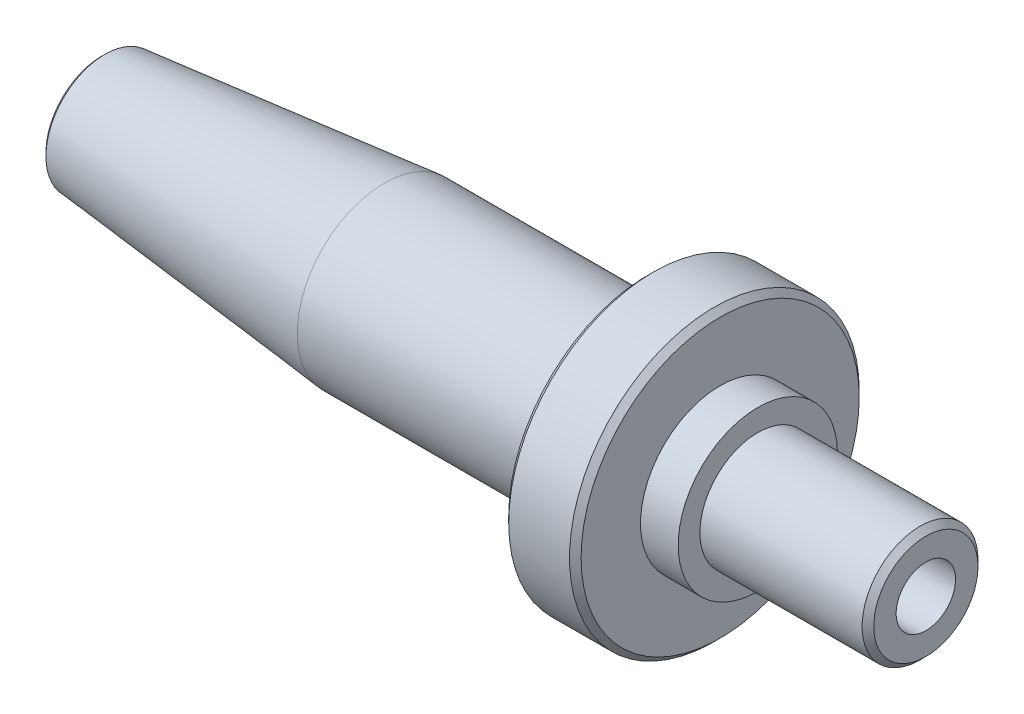
ISO-10303-21;
HEADER;
FILE_DESCRIPTION(('STEP AP214'),'2;1');
FILE_NAME('part.step','',(''),(''),'','','');
FILE_SCHEMA(('AUTOMOTIVE_DESIGN { 1 0 10303 214 1 1 1 1 }'));
ENDSEC;
DATA;
#1=APPLICATION_CONTEXT('core data for automotive mechanical design processes');
#2=APPLICATION_PROTOCOL_DEFINITION('international standard','automotive_design',2000,#1);
#3=PRODUCT_CONTEXT('',#1,'mechanical');
#4=PRODUCT('Part','Part','',(#3));
#5=PRODUCT_RELATED_PRODUCT_CATEGORY('part','',(#4));
#6=PRODUCT_DEFINITION_FORMATION('','',#4);
#7=PRODUCT_DEFINITION_CONTEXT('part definition',#1,'design');
#8=PRODUCT_DEFINITION('design','',#6,#7);
#9=PRODUCT_DEFINITION_SHAPE('','',#8);
#10=(LENGTH_UNIT() NAMED_UNIT(*) SI_UNIT(.MILLI.,.METRE.));
#11=(NAMED_UNIT(*) PLANE_ANGLE_UNIT() SI_UNIT($,.RADIAN.));
#12=(NAMED_UNIT(*) SI_UNIT($,.STERADIAN.) SOLID_ANGLE_UNIT());
#13=UNCERTAINTY_MEASURE_WITH_UNIT(LENGTH_MEASURE(1.E-05),#10,'distance_accuracy_value','');
#14=(GEOMETRIC_REPRESENTATION_CONTEXT(3) GLOBAL_UNCERTAINTY_ASSIGNED_CONTEXT((#13)) GLOBAL_UNIT_ASSIGNED_CONTEXT((#10,
#11,#12)) REPRESENTATION_CONTEXT('',''));
#15=CARTESIAN_POINT('',(0.,0.,0.));
#16=DIRECTION('',(0.,0.,1.));
#17=DIRECTION('',(1.,0.,0.));
#18=AXIS2_PLACEMENT_3D('',#15,#16,#17);
#19=CARTESIAN_POINT('',(-14.225,0.,0.));
#20=DIRECTION('',(-1.,0.,0.));
#21=DIRECTION('',(0.,0.,1.));
#22=AXIS2_PLACEMENT_3D('',#19,#20,#21);
#23=PLANE('',#22);
#24=CARTESIAN_POINT('',(-14.225,0.,0.));
#25=DIRECTION('',(-1.,0.,0.));
#26=DIRECTION('',(0.,0.,1.));
#27=AXIS2_PLACEMENT_3D('',#24,#25,#26);
#28=CIRCLE('',#27,1.25);
#29=CARTESIAN_POINT('',(-14.225,0.,1.25));
#30=VERTEX_POINT('',#29);
#31=EDGE_CURVE('E63',#30,#30,#28,.T.);
#32=ORIENTED_EDGE('',*,*,#31,.F.);
#33=EDGE_LOOP('',(#32));
#34=FACE_BOUND('',#33,.T.);
#35=CARTESIAN_POINT('',(-14.225,0.,0.));
#36=DIRECTION('',(-1.,0.,0.));
#37=DIRECTION('',(0.,0.,1.));
#38=AXIS2_PLACEMENT_3D('',#35,#36,#37);
#39=CIRCLE('',#38,1.92500000000001);
#40=CARTESIAN_POINT('',(-14.225,0.,-1.92500000000001));
#41=VERTEX_POINT('',#40);
#42=EDGE_CURVE('E95',#41,#41,#39,.T.);
#43=ORIENTED_EDGE('',*,*,#42,.T.);
#44=EDGE_LOOP('',(#43));
#45=FACE_BOUND('',#44,.T.);
#46=ADVANCED_FACE('F39',(#34,#45),#23,.T.);
#47=CARTESIAN_POINT('',(-4.475,0.,0.));
#48=DIRECTION('',(1.,0.,0.));
#49=DIRECTION('',(0.,0.,-1.));
#50=AXIS2_PLACEMENT_3D('',#47,#48,#49);
#51=CONICAL_SURFACE('',#50,3.00000000000001,0.0996686524911621);
#52=CARTESIAN_POINT('',(-14.1138888888889,0.,0.));
#53=DIRECTION('',(-1.,0.,0.));
#54=DIRECTION('',(0.,0.,1.));
#55=AXIS2_PLACEMENT_3D('',#52,#53,#54);
#56=CIRCLE('',#55,2.03611111111112);
#57=CARTESIAN_POINT('',(-14.1138888888889,0.,-2.03611111111112));
#58=VERTEX_POINT('',#57);
#59=EDGE_CURVE('E92',#58,#58,#56,.F.);
#60=ORIENTED_EDGE('',*,*,#59,.T.);
#61=EDGE_LOOP('',(#60));
#62=FACE_BOUND('',#61,.T.);
#63=CARTESIAN_POINT('',(-4.475,0.,0.));
#64=DIRECTION('',(1.,0.,0.));
#65=DIRECTION('',(0.,0.,-1.));
#66=AXIS2_PLACEMENT_3D('',#63,#64,#65);
#67=CIRCLE('',#66,3.00000000000001);
#68=CARTESIAN_POINT('',(-4.475,0.,-3.00000000000001));
#69=VERTEX_POINT('',#68);
#70=EDGE_CURVE('E89',#69,#69,#67,.T.);
#71=ORIENTED_EDGE('',*,*,#70,.F.);
#72=EDGE_LOOP('',(#71));
#73=FACE_BOUND('',#72,.T.);
#74=ADVANCED_FACE('F157',(#62,#73),#51,.T.);
#75=CARTESIAN_POINT('',(14.225,0.,0.));
#76=DIRECTION('',(1.,0.,0.));
#77=DIRECTION('',(0.,0.,-1.));
#78=AXIS2_PLACEMENT_3D('',#75,#76,#77);
#79=CYLINDRICAL_SURFACE('',#78,3.00000000000001);
#80=ORIENTED_EDGE('',*,*,#70,.T.);
#81=EDGE_LOOP('',(#80));
#82=FACE_BOUND('',#81,.T.);
#83=CARTESIAN_POINT('',(3.625,0.,0.));
#84=DIRECTION('',(1.,0.,0.));
#85=DIRECTION('',(0.,0.,-1.));
#86=AXIS2_PLACEMENT_3D('',#83,#84,#85);
#87=CIRCLE('',#86,3.00000000000001);
#88=CARTESIAN_POINT('',(3.625,0.,-3.00000000000001));
#89=VERTEX_POINT('',#88);
#90=EDGE_CURVE('E86',#89,#89,#87,.T.);
#91=ORIENTED_EDGE('',*,*,#90,.F.);
#92=EDGE_LOOP('',(#91));
#93=FACE_BOUND('',#92,.T.);
#94=ADVANCED_FACE('F163',(#82,#93),#79,.T.);
#95=CARTESIAN_POINT('',(3.625,3.,0.));
#96=DIRECTION('',(-1.,0.,0.));
#97=DIRECTION('',(0.,0.,1.));
#98=AXIS2_PLACEMENT_3D('',#95,#96,#97);
#99=PLANE('',#98);
#100=CARTESIAN_POINT('',(3.625,0.,0.));
#101=DIRECTION('',(-1.,0.,0.));
#102=DIRECTION('',(0.,0.,1.));
#103=AXIS2_PLACEMENT_3D('',#100,#101,#102);
#104=CIRCLE('',#103,3.3);
#105=CARTESIAN_POINT('',(3.625,0.,3.3));
#106=VERTEX_POINT('',#105);
#107=EDGE_CURVE('E101',#106,#106,#104,.T.);
#108=ORIENTED_EDGE('',*,*,#107,.T.);
#109=EDGE_LOOP('',(#108));
#110=FACE_BOUND('',#109,.T.);
#111=ORIENTED_EDGE('',*,*,#90,.T.);
#112=EDGE_LOOP('',(#111));
#113=FACE_BOUND('',#112,.T.);
#114=ADVANCED_FACE('F250',(#110,#113),#99,.T.);
#115=CARTESIAN_POINT('',(14.225,0.,0.));
#116=DIRECTION('',(1.,0.,0.));
#117=DIRECTION('',(0.,0.,-1.));
#118=AXIS2_PLACEMENT_3D('',#115,#116,#117);
#119=CYLINDRICAL_SURFACE('',#118,3.5);
#120=CARTESIAN_POINT('',(3.825,0.,0.));
#121=DIRECTION('',(-1.,0.,0.));
#122=DIRECTION('',(0.,0.,1.));
#123=AXIS2_PLACEMENT_3D('',#120,#121,#122);
#124=CIRCLE('',#123,3.5);
#125=CARTESIAN_POINT('',(3.825,0.,3.5));
#126=VERTEX_POINT('',#125);
#127=EDGE_CURVE('E98',#126,#126,#124,.F.);
#128=ORIENTED_EDGE('',*,*,#127,.T.);
#129=EDGE_LOOP('',(#128));
#130=FACE_BOUND('',#129,.T.);
#131=CARTESIAN_POINT('',(4.625,0.,0.));
#132=DIRECTION('',(1.,0.,0.));
#133=DIRECTION('',(0.,0.,-1.));
#134=AXIS2_PLACEMENT_3D('',#131,#132,#133);
#135=CIRCLE('',#134,3.5);
#136=CARTESIAN_POINT('',(4.625,0.,-3.5));
#137=VERTEX_POINT('',#136);
#138=EDGE_CURVE('E83',#137,#137,#135,.T.);
#139=ORIENTED_EDGE('',*,*,#138,.F.);
#140=EDGE_LOOP('',(#139));
#141=FACE_BOUND('',#140,.T.);
#142=ADVANCED_FACE('F255',(#130,#141),#119,.T.);
#143=CARTESIAN_POINT('',(4.625,3.5,0.));
#144=DIRECTION('',(-1.,0.,0.));
#145=DIRECTION('',(0.,0.,1.));
#146=AXIS2_PLACEMENT_3D('',#143,#144,#145);
#147=PLANE('',#146);
#148=CARTESIAN_POINT('',(4.625,0.,0.));
#149=DIRECTION('',(-1.,0.,0.));
#150=DIRECTION('',(0.,0.,1.));
#151=AXIS2_PLACEMENT_3D('',#148,#149,#150);
#152=CIRCLE('',#151,4.8);
#153=CARTESIAN_POINT('',(4.625,0.,4.8));
#154=VERTEX_POINT('',#153);
#155=EDGE_CURVE('E11',#154,#154,#152,.T.);
#156=ORIENTED_EDGE('',*,*,#155,.T.);
#157=EDGE_LOOP('',(#156));
#158=FACE_BOUND('',#157,.T.);
#159=ORIENTED_EDGE('',*,*,#138,.T.);
#160=EDGE_LOOP('',(#159));
#161=FACE_BOUND('',#160,.T.);
#162=ADVANCED_FACE('F266',(#158,#161),#147,.T.);
#163=CARTESIAN_POINT('',(14.225,0.,0.));
#164=DIRECTION('',(1.,0.,0.));
#165=DIRECTION('',(0.,0.,-1.));
#166=AXIS2_PLACEMENT_3D('',#163,#164,#165);
#167=CYLINDRICAL_SURFACE('',#166,5.);
#168=CARTESIAN_POINT('',(6.92499999999999,0.,0.));
#169=DIRECTION('',(1.,0.,0.));
#170=DIRECTION('',(0.,0.,-1.));
#171=AXIS2_PLACEMENT_3D('',#168,#169,#170);
#172=CIRCLE('',#171,5.);
#173=CARTESIAN_POINT('',(6.92499999999999,0.,-5.));
#174=VERTEX_POINT('',#173);
#175=EDGE_CURVE('E47',#174,#174,#172,.F.);
#176=ORIENTED_EDGE('',*,*,#175,.T.);
#177=EDGE_LOOP('',(#176));
#178=FACE_BOUND('',#177,.T.);
#179=CARTESIAN_POINT('',(4.825,0.,0.));
#180=DIRECTION('',(-1.,0.,0.));
#181=DIRECTION('',(0.,0.,1.));
#182=AXIS2_PLACEMENT_3D('',#179,#180,#181);
#183=CIRCLE('',#182,5.);
#184=CARTESIAN_POINT('',(4.825,0.,5.));
#185=VERTEX_POINT('',#184);
#186=EDGE_CURVE('E113',#185,#185,#183,.F.);
#187=ORIENTED_EDGE('',*,*,#186,.T.);
#188=EDGE_LOOP('',(#187));
#189=FACE_BOUND('',#188,.T.);
#190=ADVANCED_FACE('F118',(#178,#189),#167,.T.);
#191=CARTESIAN_POINT('',(7.125,5.,0.));
#192=DIRECTION('',(1.,0.,0.));
#193=DIRECTION('',(0.,0.,-1.));
#194=AXIS2_PLACEMENT_3D('',#191,#192,#193);
#195=PLANE('',#194);
#196=CARTESIAN_POINT('',(7.125,0.,0.));
#197=DIRECTION('',(1.,0.,0.));
#198=DIRECTION('',(0.,0.,-1.));
#199=AXIS2_PLACEMENT_3D('',#196,#197,#198);
#200=CIRCLE('',#199,4.8);
#201=CARTESIAN_POINT('',(7.125,0.,-4.8));
#202=VERTEX_POINT('',#201);
#203=EDGE_CURVE('E110',#202,#202,#200,.T.);
#204=ORIENTED_EDGE('',*,*,#203,.T.);
#205=EDGE_LOOP('',(#204));
#206=FACE_BOUND('',#205,.T.);
#207=CARTESIAN_POINT('',(7.125,0.,0.));
#208=DIRECTION('',(1.,0.,0.));
#209=DIRECTION('',(0.,0.,-1.));
#210=AXIS2_PLACEMENT_3D('',#207,#208,#209);
#211=CIRCLE('',#210,2.75);
#212=CARTESIAN_POINT('',(7.125,0.,-2.75));
#213=VERTEX_POINT('',#212);
#214=EDGE_CURVE('E80',#213,#213,#211,.T.);
#215=ORIENTED_EDGE('',*,*,#214,.F.);
#216=EDGE_LOOP('',(#215));
#217=FACE_BOUND('',#216,.T.);
#218=ADVANCED_FACE('F127',(#206,#217),#195,.T.);
#219=CARTESIAN_POINT('',(14.225,0.,0.));
#220=DIRECTION('',(1.,0.,0.));
#221=DIRECTION('',(0.,0.,-1.));
#222=AXIS2_PLACEMENT_3D('',#219,#220,#221);
#223=CYLINDRICAL_SURFACE('',#222,2.75);
#224=ORIENTED_EDGE('',*,*,#214,.T.);
#225=EDGE_LOOP('',(#224));
#226=FACE_BOUND('',#225,.T.);
#227=CARTESIAN_POINT('',(8.425,0.,0.));
#228=DIRECTION('',(1.,0.,0.));
#229=DIRECTION('',(0.,0.,-1.));
#230=AXIS2_PLACEMENT_3D('',#227,#228,#229);
#231=CIRCLE('',#230,2.75);
#232=CARTESIAN_POINT('',(8.425,0.,-2.75));
#233=VERTEX_POINT('',#232);
#234=EDGE_CURVE('E77',#233,#233,#231,.T.);
#235=ORIENTED_EDGE('',*,*,#234,.F.);
#236=EDGE_LOOP('',(#235));
#237=FACE_BOUND('',#236,.T.);
#238=ADVANCED_FACE('F130',(#226,#237),#223,.T.);
#239=CARTESIAN_POINT('',(8.425,2.75,0.));
#240=DIRECTION('',(1.,0.,0.));
#241=DIRECTION('',(0.,0.,-1.));
#242=AXIS2_PLACEMENT_3D('',#239,#240,#241);
#243=PLANE('',#242);
#244=ORIENTED_EDGE('',*,*,#234,.T.);
#245=EDGE_LOOP('',(#244));
#246=FACE_BOUND('',#245,.T.);
#247=CARTESIAN_POINT('',(8.425,0.,0.));
#248=DIRECTION('',(1.,0.,0.));
#249=DIRECTION('',(0.,0.,-1.));
#250=AXIS2_PLACEMENT_3D('',#247,#248,#249);
#251=CIRCLE('',#250,2.);
#252=CARTESIAN_POINT('',(8.425,0.,-2.));
#253=VERTEX_POINT('',#252);
#254=EDGE_CURVE('E74',#253,#253,#251,.T.);
#255=ORIENTED_EDGE('',*,*,#254,.F.);
#256=EDGE_LOOP('',(#255));
#257=FACE_BOUND('',#256,.T.);
#258=ADVANCED_FACE('F136',(#246,#257),#243,.T.);
#259=CARTESIAN_POINT('',(14.225,0.,0.));
#260=DIRECTION('',(1.,0.,0.));
#261=DIRECTION('',(0.,0.,-1.));
#262=AXIS2_PLACEMENT_3D('',#259,#260,#261);
#263=CYLINDRICAL_SURFACE('',#262,2.);
#264=CARTESIAN_POINT('',(14.025,0.,0.));
#265=DIRECTION('',(1.,0.,0.));
#266=DIRECTION('',(0.,0.,-1.));
#267=AXIS2_PLACEMENT_3D('',#264,#265,#266);
#268=CIRCLE('',#267,2.);
#269=CARTESIAN_POINT('',(14.025,0.,-2.));
#270=VERTEX_POINT('',#269);
#271=EDGE_CURVE('E107',#270,#270,#268,.F.);
#272=ORIENTED_EDGE('',*,*,#271,.T.);
#273=EDGE_LOOP('',(#272));
#274=FACE_BOUND('',#273,.T.);
#275=ORIENTED_EDGE('',*,*,#254,.T.);
#276=EDGE_LOOP('',(#275));
#277=FACE_BOUND('',#276,.T.);
#278=ADVANCED_FACE('F142',(#274,#277),#263,.T.);
#279=CARTESIAN_POINT('',(14.225,2.,0.));
#280=DIRECTION('',(1.,0.,0.));
#281=DIRECTION('',(0.,0.,-1.));
#282=AXIS2_PLACEMENT_3D('',#279,#280,#281);
#283=PLANE('',#282);
#284=CARTESIAN_POINT('',(14.225,0.,0.));
#285=DIRECTION('',(1.,0.,0.));
#286=DIRECTION('',(0.,0.,-1.));
#287=AXIS2_PLACEMENT_3D('',#284,#285,#286);
#288=CIRCLE('',#287,1.025);
#289=CARTESIAN_POINT('',(14.225,0.,-1.025));
#290=VERTEX_POINT('',#289);
#291=EDGE_CURVE('E64',#290,#290,#288,.T.);
#292=ORIENTED_EDGE('',*,*,#291,.F.);
#293=EDGE_LOOP('',(#292));
#294=FACE_BOUND('',#293,.T.);
#295=CARTESIAN_POINT('',(14.225,0.,0.));
#296=DIRECTION('',(1.,0.,0.));
#297=DIRECTION('',(0.,0.,-1.));
#298=AXIS2_PLACEMENT_3D('',#295,#296,#297);
#299=CIRCLE('',#298,1.8);
#300=CARTESIAN_POINT('',(14.225,0.,-1.8));
#301=VERTEX_POINT('',#300);
#302=EDGE_CURVE('E104',#301,#301,#299,.T.);
#303=ORIENTED_EDGE('',*,*,#302,.T.);
#304=EDGE_LOOP('',(#303));
#305=FACE_BOUND('',#304,.T.);
#306=ADVANCED_FACE('F147',(#294,#305),#283,.T.);
#307=CARTESIAN_POINT('',(-14.1138888888889,0.,0.));
#308=DIRECTION('',(1.,0.,0.));
#309=DIRECTION('',(0.,0.,-1.));
#310=AXIS2_PLACEMENT_3D('',#307,#308,#309);
#311=CONICAL_SURFACE('',#310,2.03611111111112,0.78539816339745);
#312=CARTESIAN_POINT('',(-14.225,0.,-1.92500000000001));
#313=CARTESIAN_POINT('',(-14.2238425925926,0.,-1.92615740740742));
#314=CARTESIAN_POINT('',(-14.2226851851852,0.,-1.92731481481482));
#315=CARTESIAN_POINT('',(-14.2203703703704,0.,-1.92962962962964));
#316=CARTESIAN_POINT('',(-14.219212962963,0.,-1.93078703703705));
#317=CARTESIAN_POINT('',(-14.2168981481481,0.,-1.93310185185186));
#318=CARTESIAN_POINT('',(-14.2157407407407,0.,-1.93425925925927));
#319=CARTESIAN_POINT('',(-14.2134259259259,0.,-1.93657407407408));
#320=CARTESIAN_POINT('',(-14.2122685185185,0.,-1.93773148148149));
#321=CARTESIAN_POINT('',(-14.2099537037037,0.,-1.9400462962963));
#322=CARTESIAN_POINT('',(-14.2087962962963,0.,-1.94120370370371));
#323=CARTESIAN_POINT('',(-14.2064814814815,0.,-1.94351851851853));
#324=CARTESIAN_POINT('',(-14.2053240740741,0.,-1.94467592592593));
#325=CARTESIAN_POINT('',(-14.2030092592593,0.,-1.94699074074075));
#326=CARTESIAN_POINT('',(-14.2018518518519,0.,-1.94814814814816));
#327=CARTESIAN_POINT('',(-14.199537037037,0.,-1.95046296296297));
#328=CARTESIAN_POINT('',(-14.1983796296296,0.,-1.95162037037038));
#329=CARTESIAN_POINT('',(-14.1960648148148,0.,-1.95393518518519));
#330=CARTESIAN_POINT('',(-14.1949074074074,0.,-1.9550925925926));
#331=CARTESIAN_POINT('',(-14.1925925925926,0.,-1.95740740740742));
#332=CARTESIAN_POINT('',(-14.1914351851852,0.,-1.95856481481482));
#333=CARTESIAN_POINT('',(-14.1891203703704,0.,-1.96087962962964));
#334=CARTESIAN_POINT('',(-14.187962962963,0.,-1.96203703703704));
#335=CARTESIAN_POINT('',(-14.1856481481481,0.,-1.96435185185186));
#336=CARTESIAN_POINT('',(-14.1844907407407,0.,-1.96550925925927));
#337=CARTESIAN_POINT('',(-14.1821759259259,0.,-1.96782407407408));
#338=CARTESIAN_POINT('',(-14.1810185185185,0.,-1.96898148148149));
#339=CARTESIAN_POINT('',(-14.1787037037037,0.,-1.9712962962963));
#340=CARTESIAN_POINT('',(-14.1775462962963,0.,-1.97245370370371));
#341=CARTESIAN_POINT('',(-14.1752314814815,0.,-1.97476851851853));
#342=CARTESIAN_POINT('',(-14.1740740740741,0.,-1.97592592592593));
#343=CARTESIAN_POINT('',(-14.1717592592593,0.,-1.97824074074075));
#344=CARTESIAN_POINT('',(-14.1706018518519,0.,-1.97939814814815));
#345=CARTESIAN_POINT('',(-14.168287037037,0.,-1.98171296296297));
#346=CARTESIAN_POINT('',(-14.1671296296296,0.,-1.98287037037038));
#347=CARTESIAN_POINT('',(-14.1648148148148,0.,-1.98518518518519));
#348=CARTESIAN_POINT('',(-14.1636574074074,0.,-1.9863425925926));
#349=CARTESIAN_POINT('',(-14.1613425925926,0.,-1.98865740740741));
#350=CARTESIAN_POINT('',(-14.1601851851852,0.,-1.98981481481482));
#351=CARTESIAN_POINT('',(-14.1578703703704,0.,-1.99212962962964));
#352=CARTESIAN_POINT('',(-14.156712962963,0.,-1.99328703703704));
#353=CARTESIAN_POINT('',(-14.1543981481482,0.,-1.99560185185186));
#354=CARTESIAN_POINT('',(-14.1532407407407,0.,-1.99675925925927));
#355=CARTESIAN_POINT('',(-14.1509259259259,0.,-1.99907407407408));
#356=CARTESIAN_POINT('',(-14.1497685185185,0.,-2.00023148148149));
#357=CARTESIAN_POINT('',(-14.1474537037037,0.,-2.0025462962963));
#358=CARTESIAN_POINT('',(-14.1462962962963,0.,-2.00370370370371));
#359=CARTESIAN_POINT('',(-14.1439814814815,0.,-2.00601851851852));
#360=CARTESIAN_POINT('',(-14.1428240740741,0.,-2.00717592592593));
#361=CARTESIAN_POINT('',(-14.1405092592593,0.,-2.00949074074075));
#362=CARTESIAN_POINT('',(-14.1393518518519,0.,-2.01064814814815));
#363=CARTESIAN_POINT('',(-14.137037037037,0.,-2.01296296296297));
#364=CARTESIAN_POINT('',(-14.1358796296296,0.,-2.01412037037038));
#365=CARTESIAN_POINT('',(-14.1335648148148,0.,-2.01643518518519));
#366=CARTESIAN_POINT('',(-14.1324074074074,0.,-2.0175925925926));
#367=CARTESIAN_POINT('',(-14.1300925925926,0.,-2.01990740740741));
#368=CARTESIAN_POINT('',(-14.1289351851852,0.,-2.02106481481482));
#369=CARTESIAN_POINT('',(-14.1266203703704,0.,-2.02337962962963));
#370=CARTESIAN_POINT('',(-14.125462962963,0.,-2.02453703703704));
#371=CARTESIAN_POINT('',(-14.1231481481482,0.,-2.02685185185186));
#372=CARTESIAN_POINT('',(-14.1219907407407,0.,-2.02800925925926));
#373=CARTESIAN_POINT('',(-14.1196759259259,0.,-2.03032407407408));
#374=CARTESIAN_POINT('',(-14.1185185185185,0.,-2.03148148148149));
#375=CARTESIAN_POINT('',(-14.1162037037037,0.,-2.0337962962963));
#376=CARTESIAN_POINT('',(-14.1150462962963,0.,-2.03495370370371));
#377=CARTESIAN_POINT('',(-14.1138888888889,0.,-2.03611111111112));
#378=B_SPLINE_CURVE_WITH_KNOTS('',3,(#312,#313,#314,#315,#316,#317,#318,#319,#320,#321,#322,
#323,#324,#325,#326,#327,#328,#329,#330,#331,#332,#333,#334,#335,#336,#337,#338,#339,#340,#341,
#342,#343,#344,#345,#346,#347,#348,#349,#350,#351,#352,#353,#354,#355,#356,#357,#358,#359,#360,
#361,#362,#363,#364,#365,#366,#367,#368,#369,#370,#371,#372,#373,#374,#375,#376,#377),
.UNSPECIFIED.,.F.,.F.,(4,2,2,2,2,2,2,2,2,2,2,2,2,2,2,2,2,2,2,2,2,2,2,2,2,2,2,2,2,2,2,2,4),(0.,
0.00491046375823988,0.00982092751647977,0.0147313912747198,0.0196418550329597,
0.0245523187911983,0.0294627825494384,0.0343732463076783,0.0392837100659182,0.044194173824158,
0.0491046375823967,0.0540151013406369,0.0589255650988768,0.0638360288571166,0.0687464926153553,
0.0736569563735952,0.0785674201318351,0.0834778838900753,0.0883883476483151,0.0932988114065538,
0.0982092751647937,0.103119738923034,0.108030202681273,0.112940666439512,0.117851130197752,
0.122761593955992,0.127672057714232,0.132582521472472,0.137492985230711,0.142403448988951,
0.147313912747191,0.152224376505431,0.15713484026367),.UNSPECIFIED.);
#379=EDGE_CURVE('BSEAM153',#41,#58,#378,.T.);
#380=ORIENTED_EDGE('',*,*,#42,.F.);
#381=ORIENTED_EDGE('',*,*,#59,.F.);
#382=ORIENTED_EDGE('',*,*,#379,.T.);
#383=ORIENTED_EDGE('',*,*,#379,.F.);
#384=EDGE_LOOP('',(#380,#382,#381,#383));
#385=FACE_BOUND('',#384,.T.);
#386=ADVANCED_FACE('F153',(#385),#311,.T.);
#387=CARTESIAN_POINT('',(3.825,0.,0.));
#388=DIRECTION('',(1.,0.,0.));
#389=DIRECTION('',(0.,0.,-1.));
#390=AXIS2_PLACEMENT_3D('',#387,#388,#389);
#391=CONICAL_SURFACE('',#390,3.5,0.785398163397459);
#392=ORIENTED_EDGE('',*,*,#107,.F.);
#393=EDGE_LOOP('',(#392));
#394=FACE_BOUND('',#393,.T.);
#395=ORIENTED_EDGE('',*,*,#127,.F.);
#396=EDGE_LOOP('',(#395));
#397=FACE_BOUND('',#396,.T.);
#398=ADVANCED_FACE('F172',(#394,#397),#391,.T.);
#399=CARTESIAN_POINT('',(14.225,0.,0.));
#400=DIRECTION('',(-1.,0.,0.));
#401=DIRECTION('',(0.,0.,1.));
#402=AXIS2_PLACEMENT_3D('',#399,#400,#401);
#403=CONICAL_SURFACE('',#402,1.8,0.785398163397438);
#404=ORIENTED_EDGE('',*,*,#271,.F.);
#405=EDGE_LOOP('',(#404));
#406=FACE_BOUND('',#405,.T.);
#407=ORIENTED_EDGE('',*,*,#302,.F.);
#408=EDGE_LOOP('',(#407));
#409=FACE_BOUND('',#408,.T.);
#410=ADVANCED_FACE('F124',(#406,#409),#403,.T.);
#411=CARTESIAN_POINT('',(7.125,0.,0.));
#412=DIRECTION('',(-1.,0.,0.));
#413=DIRECTION('',(0.,0.,1.));
#414=AXIS2_PLACEMENT_3D('',#411,#412,#413);
#415=CONICAL_SURFACE('',#414,4.8,0.785398163397444);
#416=ORIENTED_EDGE('',*,*,#175,.F.);
#417=EDGE_LOOP('',(#416));
#418=FACE_BOUND('',#417,.T.);
#419=ORIENTED_EDGE('',*,*,#203,.F.);
#420=EDGE_LOOP('',(#419));
#421=FACE_BOUND('',#420,.T.);
#422=ADVANCED_FACE('F121',(#418,#421),#415,.T.);
#423=CARTESIAN_POINT('',(4.825,0.,0.));
#424=DIRECTION('',(1.,0.,0.));
#425=DIRECTION('',(0.,0.,-1.));
#426=AXIS2_PLACEMENT_3D('',#423,#424,#425);
#427=CONICAL_SURFACE('',#426,5.,0.785398163397457);
#428=ORIENTED_EDGE('',*,*,#155,.F.);
#429=EDGE_LOOP('',(#428));
#430=FACE_BOUND('',#429,.T.);
#431=ORIENTED_EDGE('',*,*,#186,.F.);
#432=EDGE_LOOP('',(#431));
#433=FACE_BOUND('',#432,.T.);
#434=ADVANCED_FACE('F41',(#430,#433),#427,.T.);
#435=CARTESIAN_POINT('',(-5.725,0.,0.));
#436=DIRECTION('',(-1.,0.,0.));
#437=DIRECTION('',(0.,0.,1.));
#438=AXIS2_PLACEMENT_3D('',#435,#436,#437);
#439=CONICAL_SURFACE('',#438,1.25,1.02974425867665);
#440=CARTESIAN_POINT('',(-4.97392422621555,0.,0.));
#441=VERTEX_POINT('',#440);
#442=VERTEX_LOOP('',#441);
#443=FACE_BOUND('',#442,.T.);
#444=CARTESIAN_POINT('',(-5.725,0.,0.));
#445=DIRECTION('',(-1.,0.,0.));
#446=DIRECTION('',(0.,0.,1.));
#447=AXIS2_PLACEMENT_3D('',#444,#445,#446);
#448=CIRCLE('',#447,1.25);
#449=CARTESIAN_POINT('',(-5.725,0.,1.25));
#450=VERTEX_POINT('',#449);
#451=EDGE_CURVE('E67',#450,#450,#448,.T.);
#452=ORIENTED_EDGE('',*,*,#451,.T.);
#453=EDGE_LOOP('',(#452));
#454=FACE_BOUND('',#453,.T.);
#455=ADVANCED_FACE('F197',(#443,#454),#439,.F.);
#456=CARTESIAN_POINT('',(-14.225,0.,0.));
#457=DIRECTION('',(-1.,0.,0.));
#458=DIRECTION('',(0.,0.,1.));
#459=AXIS2_PLACEMENT_3D('',#456,#457,#458);
#460=CYLINDRICAL_SURFACE('',#459,1.25);
#461=ORIENTED_EDGE('',*,*,#451,.F.);
#462=EDGE_LOOP('',(#461));
#463=FACE_BOUND('',#462,.T.);
#464=ORIENTED_EDGE('',*,*,#31,.T.);
#465=EDGE_LOOP('',(#464));
#466=FACE_BOUND('',#465,.T.);
#467=ADVANCED_FACE('F57',(#463,#466),#460,.F.);
#468=CARTESIAN_POINT('',(5.975,0.,0.));
#469=DIRECTION('',(1.,0.,0.));
#470=DIRECTION('',(0.,0.,-1.));
#471=AXIS2_PLACEMENT_3D('',#468,#469,#470);
#472=CONICAL_SURFACE('',#471,1.025,1.02974425867665);
#473=CARTESIAN_POINT('',(5.35911786549675,0.,0.));
#474=VERTEX_POINT('',#473);
#475=VERTEX_LOOP('',#474);
#476=FACE_BOUND('',#475,.T.);
#477=CARTESIAN_POINT('',(5.975,0.,0.));
#478=DIRECTION('',(1.,0.,0.));
#479=DIRECTION('',(0.,0.,-1.));
#480=AXIS2_PLACEMENT_3D('',#477,#478,#479);
#481=CIRCLE('',#480,1.025);
#482=CARTESIAN_POINT('',(5.975,0.,-1.025));
#483=VERTEX_POINT('',#482);
#484=EDGE_CURVE('E61',#483,#483,#481,.T.);
#485=ORIENTED_EDGE('',*,*,#484,.T.);
#486=EDGE_LOOP('',(#485));
#487=FACE_BOUND('',#486,.T.);
#488=ADVANCED_FACE('F53',(#476,#487),#472,.F.);
#489=CARTESIAN_POINT('',(14.225,0.,0.));
#490=DIRECTION('',(1.,0.,0.));
#491=DIRECTION('',(0.,0.,-1.));
#492=AXIS2_PLACEMENT_3D('',#489,#490,#491);
#493=CYLINDRICAL_SURFACE('',#492,1.025);
#494=ORIENTED_EDGE('',*,*,#484,.F.);
#495=EDGE_LOOP('',(#494));
#496=FACE_BOUND('',#495,.T.);
#497=ORIENTED_EDGE('',*,*,#291,.T.);
#498=EDGE_LOOP('',(#497));
#499=FACE_BOUND('',#498,.T.);
#500=ADVANCED_FACE('F56',(#496,#499),#493,.F.);
#501=CLOSED_SHELL('',(#46,#74,#94,#114,#142,#162,#190,#218,#238,#258,#278,#306,#386,#398,#410,
#422,#434,#455,#467,#488,#500));
#502=MANIFOLD_SOLID_BREP('B2',#501);
#503=ADVANCED_BREP_SHAPE_REPRESENTATION('',(#18,#502),#14);
#504=SHAPE_DEFINITION_REPRESENTATION(#9,#503);
ENDSEC;
END-ISO-10303-21;
